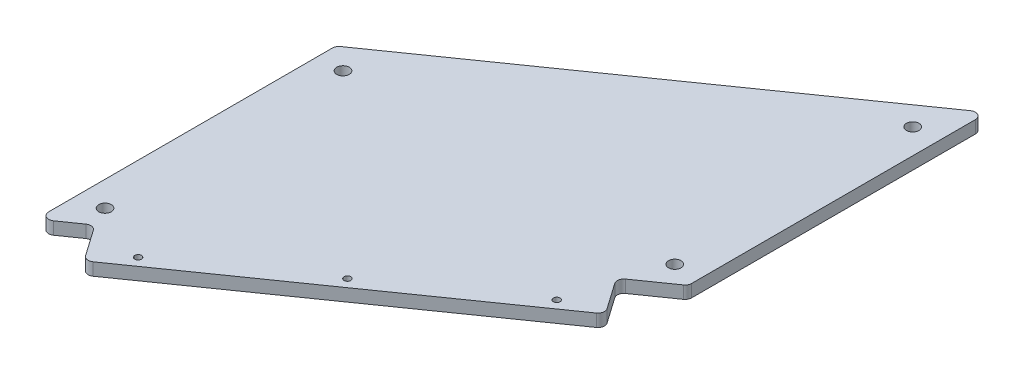
ISO-10303-21;
HEADER;
FILE_DESCRIPTION(('STEP AP214'),'2;1');
FILE_NAME('part.step','',(''),(''),'','','');
FILE_SCHEMA(('AUTOMOTIVE_DESIGN { 1 0 10303 214 1 1 1 1 }'));
ENDSEC;
DATA;
#1=APPLICATION_CONTEXT('core data for automotive mechanical design processes');
#2=APPLICATION_PROTOCOL_DEFINITION('international standard','automotive_design',2000,#1);
#3=PRODUCT_CONTEXT('',#1,'mechanical');
#4=PRODUCT('Part','Part','',(#3));
#5=PRODUCT_RELATED_PRODUCT_CATEGORY('part','',(#4));
#6=PRODUCT_DEFINITION_FORMATION('','',#4);
#7=PRODUCT_DEFINITION_CONTEXT('part definition',#1,'design');
#8=PRODUCT_DEFINITION('design','',#6,#7);
#9=PRODUCT_DEFINITION_SHAPE('','',#8);
#10=(LENGTH_UNIT() NAMED_UNIT(*) SI_UNIT(.MILLI.,.METRE.));
#11=(NAMED_UNIT(*) PLANE_ANGLE_UNIT() SI_UNIT($,.RADIAN.));
#12=(NAMED_UNIT(*) SI_UNIT($,.STERADIAN.) SOLID_ANGLE_UNIT());
#13=UNCERTAINTY_MEASURE_WITH_UNIT(LENGTH_MEASURE(1.E-05),#10,'distance_accuracy_value','');
#14=(GEOMETRIC_REPRESENTATION_CONTEXT(3) GLOBAL_UNCERTAINTY_ASSIGNED_CONTEXT((#13)) GLOBAL_UNIT_ASSIGNED_CONTEXT((#10,
#11,#12)) REPRESENTATION_CONTEXT('',''));
#15=CARTESIAN_POINT('',(0.,0.,0.));
#16=DIRECTION('',(0.,0.,1.));
#17=DIRECTION('',(1.,0.,0.));
#18=AXIS2_PLACEMENT_3D('',#15,#16,#17);
#19=CARTESIAN_POINT('',(0.,12.7,0.));
#20=DIRECTION('',(-0.573576436351042,0.,-0.819152044288995));
#21=DIRECTION('',(-0.819152044288995,0.,0.573576436351042));
#22=AXIS2_PLACEMENT_3D('',#19,#20,#21);
#23=PLANE('',#22);
#24=DIRECTION('',(0.819152044288995,0.,-0.573576436351042));
#25=VECTOR('',#24,1.);
#26=CARTESIAN_POINT('',(0.,12.7,0.));
#27=LINE('',#26,#25);
#28=CARTESIAN_POINT('',(66.3983496775089,12.7,-46.4926249688755));
#29=VERTEX_POINT('',#28);
#30=CARTESIAN_POINT('',(366.622569585501,12.7,-256.711886901579));
#31=VERTEX_POINT('',#30);
#32=EDGE_CURVE('E204',#29,#31,#27,.T.);
#33=ORIENTED_EDGE('',*,*,#32,.F.);
#34=DIRECTION('',(0.,1.,0.));
#35=VECTOR('',#34,1.);
#36=CARTESIAN_POINT('',(66.3983496775089,12.7,-46.4926249688755));
#37=LINE('',#36,#35);
#38=CARTESIAN_POINT('',(66.3983496775089,0.,-46.4926249688755));
#39=VERTEX_POINT('',#38);
#40=EDGE_CURVE('E156',#29,#39,#37,.F.);
#41=ORIENTED_EDGE('',*,*,#40,.T.);
#42=DIRECTION('',(0.819152044288995,0.,-0.573576436351042));
#43=VECTOR('',#42,1.);
#44=CARTESIAN_POINT('',(0.,0.,0.));
#45=LINE('',#44,#43);
#46=CARTESIAN_POINT('',(366.622569585501,0.,-256.711886901579));
#47=VERTEX_POINT('',#46);
#48=EDGE_CURVE('E220',#39,#47,#45,.T.);
#49=ORIENTED_EDGE('',*,*,#48,.T.);
#50=DIRECTION('',(0.,1.,0.));
#51=VECTOR('',#50,1.);
#52=CARTESIAN_POINT('',(366.622569585501,12.7,-256.711886901579));
#53=LINE('',#52,#51);
#54=EDGE_CURVE('E162',#47,#31,#53,.T.);
#55=ORIENTED_EDGE('',*,*,#54,.T.);
#56=EDGE_LOOP('',(#33,#41,#49,#55));
#57=FACE_BOUND('',#56,.T.);
#58=ADVANCED_FACE('F36',(#57),#23,.F.);
#59=CARTESIAN_POINT('',(388.9375,12.7,-272.336969392436));
#60=DIRECTION('',(-1.,0.,0.));
#61=DIRECTION('',(0.,0.,1.));
#62=AXIS2_PLACEMENT_3D('',#59,#60,#61);
#63=PLANE('',#62);
#64=DIRECTION('',(0.,0.,-1.));
#65=VECTOR('',#64,1.);
#66=CARTESIAN_POINT('',(388.9375,12.7,-272.336969392436));
#67=LINE('',#66,#65);
#68=CARTESIAN_POINT('',(388.9375,12.7,-330.968454901363));
#69=VERTEX_POINT('',#68);
#70=CARTESIAN_POINT('',(388.9375,12.7,-618.714233896365));
#71=VERTEX_POINT('',#70);
#72=EDGE_CURVE('E207',#69,#71,#67,.T.);
#73=ORIENTED_EDGE('',*,*,#72,.F.);
#74=DIRECTION('',(0.,1.,0.));
#75=VECTOR('',#74,1.);
#76=CARTESIAN_POINT('',(388.9375,12.7,-330.968454901363));
#77=LINE('',#76,#75);
#78=CARTESIAN_POINT('',(388.9375,0.,-330.968454901363));
#79=VERTEX_POINT('',#78);
#80=EDGE_CURVE('E289',#69,#79,#77,.F.);
#81=ORIENTED_EDGE('',*,*,#80,.T.);
#82=DIRECTION('',(0.,0.,-1.));
#83=VECTOR('',#82,1.);
#84=CARTESIAN_POINT('',(388.9375,0.,-272.336969392436));
#85=LINE('',#84,#83);
#86=CARTESIAN_POINT('',(388.9375,0.,-618.714233896365));
#87=VERTEX_POINT('',#86);
#88=EDGE_CURVE('E224',#79,#87,#85,.T.);
#89=ORIENTED_EDGE('',*,*,#88,.T.);
#90=DIRECTION('',(0.,-1.,0.));
#91=VECTOR('',#90,1.);
#92=CARTESIAN_POINT('',(388.9375,12.7,-618.714233896365));
#93=LINE('',#92,#91);
#94=EDGE_CURVE('E286',#87,#71,#93,.F.);
#95=ORIENTED_EDGE('',*,*,#94,.T.);
#96=EDGE_LOOP('',(#73,#81,#89,#95));
#97=FACE_BOUND('',#96,.T.);
#98=ADVANCED_FACE('F454',(#97),#63,.F.);
#99=CARTESIAN_POINT('',(0.,12.7,-359.063430470447));
#100=DIRECTION('',(0.573576436351042,0.,0.819152044288995));
#101=DIRECTION('',(0.819152044288995,0.,-0.573576436351042));
#102=AXIS2_PLACEMENT_3D('',#99,#100,#101);
#103=PLANE('',#102);
#104=DIRECTION('',(-0.819152044288995,0.,0.573576436351042));
#105=VECTOR('',#104,1.);
#106=CARTESIAN_POINT('',(0.,12.7,-359.063430470447));
#107=LINE('',#106,#105);
#108=CARTESIAN_POINT('',(378.545601214338,12.7,-624.12391399685));
#109=VERTEX_POINT('',#108);
#110=CARTESIAN_POINT('',(2.81610121433768,12.7,-361.035285769087));
#111=VERTEX_POINT('',#110);
#112=EDGE_CURVE('E212',#109,#111,#107,.T.);
#113=ORIENTED_EDGE('',*,*,#112,.F.);
#114=DIRECTION('',(0.,-1.,0.));
#115=VECTOR('',#114,1.);
#116=CARTESIAN_POINT('',(378.545601214338,12.7,-624.12391399685));
#117=LINE('',#116,#115);
#118=CARTESIAN_POINT('',(378.545601214338,0.,-624.12391399685));
#119=VERTEX_POINT('',#118);
#120=EDGE_CURVE('E295',#109,#119,#117,.T.);
#121=ORIENTED_EDGE('',*,*,#120,.T.);
#122=DIRECTION('',(-0.819152044288995,0.,0.573576436351042));
#123=VECTOR('',#122,1.);
#124=CARTESIAN_POINT('',(0.,0.,-359.063430470447));
#125=LINE('',#124,#123);
#126=CARTESIAN_POINT('',(2.81610121433768,0.,-361.035285769087));
#127=VERTEX_POINT('',#126);
#128=EDGE_CURVE('E228',#119,#127,#125,.T.);
#129=ORIENTED_EDGE('',*,*,#128,.T.);
#130=DIRECTION('',(0.,-1.,0.));
#131=VECTOR('',#130,1.);
#132=CARTESIAN_POINT('',(2.81610121433768,12.7,-361.035285769087));
#133=LINE('',#132,#131);
#134=EDGE_CURVE('E292',#127,#111,#133,.F.);
#135=ORIENTED_EDGE('',*,*,#134,.T.);
#136=EDGE_LOOP('',(#113,#121,#129,#135));
#137=FACE_BOUND('',#136,.T.);
#138=ADVANCED_FACE('F460',(#137),#103,.F.);
#139=CARTESIAN_POINT('',(0.,12.7,0.));
#140=DIRECTION('',(1.,0.,0.));
#141=DIRECTION('',(0.,0.,-1.));
#142=AXIS2_PLACEMENT_3D('',#139,#140,#141);
#143=PLANE('',#142);
#144=DIRECTION('',(0.,0.,1.));
#145=VECTOR('',#144,1.);
#146=CARTESIAN_POINT('',(0.,12.7,0.));
#147=LINE('',#146,#145);
#148=CARTESIAN_POINT('',(0.,12.7,-355.625605668603));
#149=VERTEX_POINT('',#148);
#150=CARTESIAN_POINT('',(0.,12.7,-67.8798266736002));
#151=VERTEX_POINT('',#150);
#152=EDGE_CURVE('E216',#149,#151,#147,.T.);
#153=ORIENTED_EDGE('',*,*,#152,.F.);
#154=DIRECTION('',(0.,-1.,0.));
#155=VECTOR('',#154,1.);
#156=CARTESIAN_POINT('',(0.,12.7,-355.625605668603));
#157=LINE('',#156,#155);
#158=CARTESIAN_POINT('',(0.,0.,-355.625605668603));
#159=VERTEX_POINT('',#158);
#160=EDGE_CURVE('E303',#149,#159,#157,.T.);
#161=ORIENTED_EDGE('',*,*,#160,.T.);
#162=DIRECTION('',(0.,0.,1.));
#163=VECTOR('',#162,1.);
#164=CARTESIAN_POINT('',(0.,0.,0.));
#165=LINE('',#164,#163);
#166=CARTESIAN_POINT('',(0.,0.,-67.8798266736002));
#167=VERTEX_POINT('',#166);
#168=EDGE_CURVE('E208',#159,#167,#165,.T.);
#169=ORIENTED_EDGE('',*,*,#168,.T.);
#170=DIRECTION('',(0.,1.,0.));
#171=VECTOR('',#170,1.);
#172=CARTESIAN_POINT('',(0.,12.7,-67.8798266736002));
#173=LINE('',#172,#171);
#174=EDGE_CURVE('E299',#167,#151,#173,.T.);
#175=ORIENTED_EDGE('',*,*,#174,.T.);
#176=EDGE_LOOP('',(#153,#161,#169,#175));
#177=FACE_BOUND('',#176,.T.);
#178=ADVANCED_FACE('F437',(#177),#143,.F.);
#179=CARTESIAN_POINT('',(0.,12.7,0.));
#180=DIRECTION('',(0.,1.,0.));
#181=DIRECTION('',(0.,0.,1.));
#182=AXIS2_PLACEMENT_3D('',#179,#180,#181);
#183=PLANE('',#182);
#184=CARTESIAN_POINT('',(363.5375,12.7,-580.600399862883));
#185=DIRECTION('',(0.,1.,0.));
#186=DIRECTION('',(0.,0.,1.));
#187=AXIS2_PLACEMENT_3D('',#184,#185,#186);
#188=CIRCLE('',#187,6.34999999999999);
#189=CARTESIAN_POINT('',(363.5375,12.7,-574.250399862883));
#190=VERTEX_POINT('',#189);
#191=EDGE_CURVE('E375',#190,#190,#188,.T.);
#192=ORIENTED_EDGE('',*,*,#191,.F.);
#193=EDGE_LOOP('',(#192));
#194=FACE_BOUND('',#193,.T.);
#195=CARTESIAN_POINT('',(363.5375,12.7,-339.300399862883));
#196=DIRECTION('',(0.,1.,0.));
#197=DIRECTION('',(0.,0.,1.));
#198=AXIS2_PLACEMENT_3D('',#195,#196,#197);
#199=CIRCLE('',#198,6.34999999999994);
#200=CARTESIAN_POINT('',(363.5375,12.7,-332.950399862883));
#201=VERTEX_POINT('',#200);
#202=EDGE_CURVE('E383',#201,#201,#199,.T.);
#203=ORIENTED_EDGE('',*,*,#202,.F.);
#204=EDGE_LOOP('',(#203));
#205=FACE_BOUND('',#204,.T.);
#206=CARTESIAN_POINT('',(25.4,12.7,-340.943660707083));
#207=DIRECTION('',(0.,1.,0.));
#208=DIRECTION('',(0.,0.,1.));
#209=AXIS2_PLACEMENT_3D('',#206,#207,#208);
#210=CIRCLE('',#209,6.35);
#211=CARTESIAN_POINT('',(25.4,12.7,-334.593660707083));
#212=VERTEX_POINT('',#211);
#213=EDGE_CURVE('E391',#212,#212,#210,.T.);
#214=ORIENTED_EDGE('',*,*,#213,.F.);
#215=EDGE_LOOP('',(#214));
#216=FACE_BOUND('',#215,.T.);
#217=CARTESIAN_POINT('',(25.4,12.7,-99.6436607070827));
#218=DIRECTION('',(0.,1.,0.));
#219=DIRECTION('',(0.,0.,1.));
#220=AXIS2_PLACEMENT_3D('',#217,#218,#219);
#221=CIRCLE('',#220,6.35);
#222=CARTESIAN_POINT('',(25.4,12.7,-93.2936607070828));
#223=VERTEX_POINT('',#222);
#224=EDGE_CURVE('E399',#223,#223,#221,.T.);
#225=ORIENTED_EDGE('',*,*,#224,.F.);
#226=EDGE_LOOP('',(#225));
#227=FACE_BOUND('',#226,.T.);
#228=CARTESIAN_POINT('',(85.2978199329113,12.7,-73.2920341274899));
#229=DIRECTION('',(0.,1.,0.));
#230=DIRECTION('',(0.,0.,1.));
#231=AXIS2_PLACEMENT_3D('',#228,#229,#230);
#232=CIRCLE('',#231,3.37819999999999);
#233=CARTESIAN_POINT('',(85.2978199329113,12.7,-69.9138341274899));
#234=VERTEX_POINT('',#233);
#235=EDGE_CURVE('E407',#234,#234,#232,.T.);
#236=ORIENTED_EDGE('',*,*,#235,.F.);
#237=EDGE_LOOP('',(#236));
#238=FACE_BOUND('',#237,.T.);
#239=CARTESIAN_POINT('',(334.975363032197,12.7,-248.118131927288));
#240=DIRECTION('',(0.,1.,0.));
#241=DIRECTION('',(0.,0.,1.));
#242=AXIS2_PLACEMENT_3D('',#239,#240,#241);
#243=CIRCLE('',#242,3.37819999999999);
#244=CARTESIAN_POINT('',(334.975363032197,12.7,-244.739931927288));
#245=VERTEX_POINT('',#244);
#246=EDGE_CURVE('E415',#245,#245,#243,.T.);
#247=ORIENTED_EDGE('',*,*,#246,.F.);
#248=EDGE_LOOP('',(#247));
#249=FACE_BOUND('',#248,.T.);
#250=CARTESIAN_POINT('',(210.136591482554,12.7,-160.705083027389));
#251=DIRECTION('',(0.,1.,0.));
#252=DIRECTION('',(0.,0.,1.));
#253=AXIS2_PLACEMENT_3D('',#250,#251,#252);
#254=CIRCLE('',#253,3.37819999999999);
#255=CARTESIAN_POINT('',(210.136591482554,12.7,-157.326883027389));
#256=VERTEX_POINT('',#255);
#257=EDGE_CURVE('E367',#256,#256,#254,.T.);
#258=ORIENTED_EDGE('',*,*,#257,.F.);
#259=EDGE_LOOP('',(#258));
#260=FACE_BOUND('',#259,.T.);
#261=DIRECTION('',(-0.573576436351042,0.,-0.819152044288995));
#262=VECTOR('',#261,1.);
#263=CARTESIAN_POINT('',(35.0561317367211,12.7,-79.7402284096072));
#264=LINE('',#263,#262);
#265=CARTESIAN_POINT('',(57.2007707913621,12.7,-48.1144062836977));
#266=VERTEX_POINT('',#265);
#267=CARTESIAN_POINT('',(38.8440305223833,12.7,-74.3305483091227));
#268=VERTEX_POINT('',#267);
#269=EDGE_CURVE('E169',#266,#268,#264,.T.);
#270=ORIENTED_EDGE('',*,*,#269,.F.);
#271=CARTESIAN_POINT('',(62.6104508918466,12.7,-51.90230506936));
#272=DIRECTION('',(0.,1.,0.));
#273=DIRECTION('',(0.,0.,1.));
#274=AXIS2_PLACEMENT_3D('',#271,#272,#273);
#275=CIRCLE('',#274,6.604);
#276=EDGE_CURVE('E151',#266,#29,#275,.T.);
#277=ORIENTED_EDGE('',*,*,#276,.T.);
#278=ORIENTED_EDGE('',*,*,#32,.T.);
#279=CARTESIAN_POINT('',(362.834670799839,12.7,-262.121567002064));
#280=DIRECTION('',(0.,1.,0.));
#281=DIRECTION('',(0.,0.,1.));
#282=AXIS2_PLACEMENT_3D('',#279,#280,#281);
#283=CIRCLE('',#282,6.604);
#284=CARTESIAN_POINT('',(368.244350900324,12.7,-265.909465787726));
#285=VERTEX_POINT('',#284);
#286=EDGE_CURVE('E163',#31,#285,#283,.T.);
#287=ORIENTED_EDGE('',*,*,#286,.T.);
#288=DIRECTION('',(0.573576436351042,0.,0.819152044288995));
#289=VECTOR('',#288,1.);
#290=CARTESIAN_POINT('',(346.099711845682,12.7,-297.535287913635));
#291=LINE('',#290,#289);
#292=CARTESIAN_POINT('',(349.887610631345,12.7,-292.125607813151));
#293=VERTEX_POINT('',#292);
#294=EDGE_CURVE('E195',#293,#285,#291,.T.);
#295=ORIENTED_EDGE('',*,*,#294,.F.);
#296=CARTESIAN_POINT('',(355.297290731829,12.7,-295.913506598813));
#297=DIRECTION('',(0.,1.,0.));
#298=DIRECTION('',(0.,0.,1.));
#299=AXIS2_PLACEMENT_3D('',#296,#297,#298);
#300=CIRCLE('',#299,6.604);
#301=CARTESIAN_POINT('',(351.509391946167,12.7,-301.323186699298));
#302=VERTEX_POINT('',#301);
#303=EDGE_CURVE('E314',#293,#302,#300,.F.);
#304=ORIENTED_EDGE('',*,*,#303,.T.);
#305=DIRECTION('',(-0.819152044288995,0.,0.573576436351041));
#306=VECTOR('',#305,1.);
#307=CARTESIAN_POINT('',(388.9375,12.7,-327.530630099519));
#308=LINE('',#307,#306);
#309=CARTESIAN_POINT('',(386.121398785662,12.7,-325.558774800878));
#310=VERTEX_POINT('',#309);
#311=EDGE_CURVE('E197',#310,#302,#308,.T.);
#312=ORIENTED_EDGE('',*,*,#311,.F.);
#313=CARTESIAN_POINT('',(382.3335,12.7,-330.968454901363));
#314=DIRECTION('',(0.,1.,0.));
#315=DIRECTION('',(0.,0.,1.));
#316=AXIS2_PLACEMENT_3D('',#313,#314,#315);
#317=CIRCLE('',#316,6.604);
#318=EDGE_CURVE('E245',#310,#69,#317,.T.);
#319=ORIENTED_EDGE('',*,*,#318,.T.);
#320=ORIENTED_EDGE('',*,*,#72,.T.);
#321=CARTESIAN_POINT('',(382.3335,12.7,-618.714233896365));
#322=DIRECTION('',(0.,1.,0.));
#323=DIRECTION('',(0.,0.,1.));
#324=AXIS2_PLACEMENT_3D('',#321,#322,#323);
#325=CIRCLE('',#324,6.604);
#326=EDGE_CURVE('E242',#71,#109,#325,.T.);
#327=ORIENTED_EDGE('',*,*,#326,.T.);
#328=ORIENTED_EDGE('',*,*,#112,.T.);
#329=CARTESIAN_POINT('',(6.604,12.7,-355.625605668603));
#330=DIRECTION('',(0.,1.,0.));
#331=DIRECTION('',(0.,0.,1.));
#332=AXIS2_PLACEMENT_3D('',#329,#330,#331);
#333=CIRCLE('',#332,6.604);
#334=EDGE_CURVE('E239',#111,#149,#333,.T.);
#335=ORIENTED_EDGE('',*,*,#334,.T.);
#336=ORIENTED_EDGE('',*,*,#152,.T.);
#337=CARTESIAN_POINT('',(6.604,12.7,-67.8798266736002));
#338=DIRECTION('',(0.,1.,0.));
#339=DIRECTION('',(0.,0.,1.));
#340=AXIS2_PLACEMENT_3D('',#337,#338,#339);
#341=CIRCLE('',#340,6.604);
#342=CARTESIAN_POINT('',(10.3918987856623,12.7,-62.4701465731157));
#343=VERTEX_POINT('',#342);
#344=EDGE_CURVE('E174',#151,#343,#341,.T.);
#345=ORIENTED_EDGE('',*,*,#344,.T.);
#346=DIRECTION('',(-0.819152044288995,0.,0.573576436351042));
#347=VECTOR('',#346,1.);
#348=CARTESIAN_POINT('',(0.,12.7,-55.1936607070827));
#349=LINE('',#348,#347);
#350=CARTESIAN_POINT('',(29.6464516362365,12.7,-75.9523296239449));
#351=VERTEX_POINT('',#350);
#352=EDGE_CURVE('E180',#351,#343,#349,.T.);
#353=ORIENTED_EDGE('',*,*,#352,.F.);
#354=CARTESIAN_POINT('',(33.4343504218988,12.7,-70.5426495234604));
#355=DIRECTION('',(0.,1.,0.));
#356=DIRECTION('',(0.,0.,1.));
#357=AXIS2_PLACEMENT_3D('',#354,#355,#356);
#358=CIRCLE('',#357,6.604);
#359=EDGE_CURVE('E45',#351,#268,#358,.F.);
#360=ORIENTED_EDGE('',*,*,#359,.T.);
#361=EDGE_LOOP('',(#270,#277,#278,#287,#295,#304,#312,#319,#320,#327,#328,#335,#336,#345,#353,#360));
#362=FACE_BOUND('',#361,.T.);
#363=ADVANCED_FACE('F177',(#194,#205,#216,#227,#238,#249,#260,#362),#183,.T.);
#364=CARTESIAN_POINT('',(0.,0.,0.));
#365=DIRECTION('',(0.,1.,0.));
#366=DIRECTION('',(0.,0.,1.));
#367=AXIS2_PLACEMENT_3D('',#364,#365,#366);
#368=PLANE('',#367);
#369=CARTESIAN_POINT('',(363.5375,0.,-580.600399862883));
#370=DIRECTION('',(0.,1.,0.));
#371=DIRECTION('',(0.,0.,1.));
#372=AXIS2_PLACEMENT_3D('',#369,#370,#371);
#373=CIRCLE('',#372,6.34999999999999);
#374=CARTESIAN_POINT('',(363.5375,0.,-574.250399862883));
#375=VERTEX_POINT('',#374);
#376=EDGE_CURVE('E379',#375,#375,#373,.T.);
#377=ORIENTED_EDGE('',*,*,#376,.T.);
#378=EDGE_LOOP('',(#377));
#379=FACE_BOUND('',#378,.T.);
#380=CARTESIAN_POINT('',(363.5375,0.,-339.300399862883));
#381=DIRECTION('',(0.,1.,0.));
#382=DIRECTION('',(0.,0.,1.));
#383=AXIS2_PLACEMENT_3D('',#380,#381,#382);
#384=CIRCLE('',#383,6.34999999999994);
#385=CARTESIAN_POINT('',(363.5375,0.,-332.950399862883));
#386=VERTEX_POINT('',#385);
#387=EDGE_CURVE('E387',#386,#386,#384,.T.);
#388=ORIENTED_EDGE('',*,*,#387,.T.);
#389=EDGE_LOOP('',(#388));
#390=FACE_BOUND('',#389,.T.);
#391=CARTESIAN_POINT('',(25.4,0.,-340.943660707083));
#392=DIRECTION('',(0.,1.,0.));
#393=DIRECTION('',(0.,0.,1.));
#394=AXIS2_PLACEMENT_3D('',#391,#392,#393);
#395=CIRCLE('',#394,6.35);
#396=CARTESIAN_POINT('',(25.4,0.,-334.593660707083));
#397=VERTEX_POINT('',#396);
#398=EDGE_CURVE('E395',#397,#397,#395,.T.);
#399=ORIENTED_EDGE('',*,*,#398,.T.);
#400=EDGE_LOOP('',(#399));
#401=FACE_BOUND('',#400,.T.);
#402=CARTESIAN_POINT('',(25.4,0.,-99.6436607070827));
#403=DIRECTION('',(0.,1.,0.));
#404=DIRECTION('',(0.,0.,1.));
#405=AXIS2_PLACEMENT_3D('',#402,#403,#404);
#406=CIRCLE('',#405,6.35);
#407=CARTESIAN_POINT('',(25.4,0.,-93.2936607070828));
#408=VERTEX_POINT('',#407);
#409=EDGE_CURVE('E403',#408,#408,#406,.T.);
#410=ORIENTED_EDGE('',*,*,#409,.T.);
#411=EDGE_LOOP('',(#410));
#412=FACE_BOUND('',#411,.T.);
#413=CARTESIAN_POINT('',(85.2978199329113,0.,-73.2920341274899));
#414=DIRECTION('',(0.,1.,0.));
#415=DIRECTION('',(0.,0.,1.));
#416=AXIS2_PLACEMENT_3D('',#413,#414,#415);
#417=CIRCLE('',#416,3.37819999999999);
#418=CARTESIAN_POINT('',(85.2978199329113,0.,-69.9138341274899));
#419=VERTEX_POINT('',#418);
#420=EDGE_CURVE('E411',#419,#419,#417,.T.);
#421=ORIENTED_EDGE('',*,*,#420,.T.);
#422=EDGE_LOOP('',(#421));
#423=FACE_BOUND('',#422,.T.);
#424=CARTESIAN_POINT('',(334.975363032197,0.,-248.118131927288));
#425=DIRECTION('',(0.,1.,0.));
#426=DIRECTION('',(0.,0.,1.));
#427=AXIS2_PLACEMENT_3D('',#424,#425,#426);
#428=CIRCLE('',#427,3.37819999999999);
#429=CARTESIAN_POINT('',(334.975363032197,0.,-244.739931927288));
#430=VERTEX_POINT('',#429);
#431=EDGE_CURVE('E371',#430,#430,#428,.T.);
#432=ORIENTED_EDGE('',*,*,#431,.T.);
#433=EDGE_LOOP('',(#432));
#434=FACE_BOUND('',#433,.T.);
#435=CARTESIAN_POINT('',(210.136591482554,0.,-160.705083027389));
#436=DIRECTION('',(0.,1.,0.));
#437=DIRECTION('',(0.,0.,1.));
#438=AXIS2_PLACEMENT_3D('',#435,#436,#437);
#439=CIRCLE('',#438,3.37819999999999);
#440=CARTESIAN_POINT('',(210.136591482554,0.,-157.326883027389));
#441=VERTEX_POINT('',#440);
#442=EDGE_CURVE('E201',#441,#441,#439,.T.);
#443=ORIENTED_EDGE('',*,*,#442,.T.);
#444=EDGE_LOOP('',(#443));
#445=FACE_BOUND('',#444,.T.);
#446=ORIENTED_EDGE('',*,*,#48,.F.);
#447=CARTESIAN_POINT('',(62.6104508918466,0.,-51.90230506936));
#448=DIRECTION('',(0.,1.,0.));
#449=DIRECTION('',(0.,0.,1.));
#450=AXIS2_PLACEMENT_3D('',#447,#448,#449);
#451=CIRCLE('',#450,6.604);
#452=CARTESIAN_POINT('',(57.2007707913621,0.,-48.1144062836977));
#453=VERTEX_POINT('',#452);
#454=EDGE_CURVE('E270',#39,#453,#451,.F.);
#455=ORIENTED_EDGE('',*,*,#454,.T.);
#456=DIRECTION('',(-0.573576436351042,0.,-0.819152044288995));
#457=VECTOR('',#456,1.);
#458=CARTESIAN_POINT('',(35.0561317367211,0.,-79.7402284096072));
#459=LINE('',#458,#457);
#460=CARTESIAN_POINT('',(38.8440305223833,0.,-74.3305483091227));
#461=VERTEX_POINT('',#460);
#462=EDGE_CURVE('E172',#453,#461,#459,.T.);
#463=ORIENTED_EDGE('',*,*,#462,.T.);
#464=CARTESIAN_POINT('',(33.4343504218988,0.,-70.5426495234604));
#465=DIRECTION('',(0.,1.,0.));
#466=DIRECTION('',(0.,0.,1.));
#467=AXIS2_PLACEMENT_3D('',#464,#465,#466);
#468=CIRCLE('',#467,6.604);
#469=CARTESIAN_POINT('',(29.6464516362365,0.,-75.9523296239449));
#470=VERTEX_POINT('',#469);
#471=EDGE_CURVE('E11',#461,#470,#468,.T.);
#472=ORIENTED_EDGE('',*,*,#471,.T.);
#473=DIRECTION('',(-0.819152044288995,0.,0.573576436351042));
#474=VECTOR('',#473,1.);
#475=CARTESIAN_POINT('',(0.,0.,-55.1936607070827));
#476=LINE('',#475,#474);
#477=CARTESIAN_POINT('',(10.3918987856623,0.,-62.4701465731157));
#478=VERTEX_POINT('',#477);
#479=EDGE_CURVE('E191',#470,#478,#476,.T.);
#480=ORIENTED_EDGE('',*,*,#479,.T.);
#481=CARTESIAN_POINT('',(6.604,0.,-67.8798266736002));
#482=DIRECTION('',(0.,1.,0.));
#483=DIRECTION('',(0.,0.,1.));
#484=AXIS2_PLACEMENT_3D('',#481,#482,#483);
#485=CIRCLE('',#484,6.604);
#486=EDGE_CURVE('E255',#478,#167,#485,.F.);
#487=ORIENTED_EDGE('',*,*,#486,.T.);
#488=ORIENTED_EDGE('',*,*,#168,.F.);
#489=CARTESIAN_POINT('',(6.604,0.,-355.625605668603));
#490=DIRECTION('',(0.,1.,0.));
#491=DIRECTION('',(0.,0.,1.));
#492=AXIS2_PLACEMENT_3D('',#489,#490,#491);
#493=CIRCLE('',#492,6.604);
#494=EDGE_CURVE('E258',#159,#127,#493,.F.);
#495=ORIENTED_EDGE('',*,*,#494,.T.);
#496=ORIENTED_EDGE('',*,*,#128,.F.);
#497=CARTESIAN_POINT('',(382.3335,0.,-618.714233896365));
#498=DIRECTION('',(0.,1.,0.));
#499=DIRECTION('',(0.,0.,1.));
#500=AXIS2_PLACEMENT_3D('',#497,#498,#499);
#501=CIRCLE('',#500,6.604);
#502=EDGE_CURVE('E261',#119,#87,#501,.F.);
#503=ORIENTED_EDGE('',*,*,#502,.T.);
#504=ORIENTED_EDGE('',*,*,#88,.F.);
#505=CARTESIAN_POINT('',(382.3335,0.,-330.968454901363));
#506=DIRECTION('',(0.,1.,0.));
#507=DIRECTION('',(0.,0.,1.));
#508=AXIS2_PLACEMENT_3D('',#505,#506,#507);
#509=CIRCLE('',#508,6.604);
#510=CARTESIAN_POINT('',(386.121398785662,0.,-325.558774800878));
#511=VERTEX_POINT('',#510);
#512=EDGE_CURVE('E264',#79,#511,#509,.F.);
#513=ORIENTED_EDGE('',*,*,#512,.T.);
#514=DIRECTION('',(-0.819152044288995,0.,0.573576436351041));
#515=VECTOR('',#514,1.);
#516=CARTESIAN_POINT('',(388.9375,0.,-327.530630099519));
#517=LINE('',#516,#515);
#518=CARTESIAN_POINT('',(351.509391946167,0.,-301.323186699298));
#519=VERTEX_POINT('',#518);
#520=EDGE_CURVE('E188',#511,#519,#517,.T.);
#521=ORIENTED_EDGE('',*,*,#520,.T.);
#522=CARTESIAN_POINT('',(355.297290731829,0.,-295.913506598813));
#523=DIRECTION('',(0.,1.,0.));
#524=DIRECTION('',(0.,0.,1.));
#525=AXIS2_PLACEMENT_3D('',#522,#523,#524);
#526=CIRCLE('',#525,6.604);
#527=CARTESIAN_POINT('',(349.887610631345,0.,-292.125607813151));
#528=VERTEX_POINT('',#527);
#529=EDGE_CURVE('E59',#519,#528,#526,.T.);
#530=ORIENTED_EDGE('',*,*,#529,.T.);
#531=DIRECTION('',(0.573576436351042,0.,0.819152044288995));
#532=VECTOR('',#531,1.);
#533=CARTESIAN_POINT('',(346.099711845682,0.,-297.535287913635));
#534=LINE('',#533,#532);
#535=CARTESIAN_POINT('',(368.244350900324,0.,-265.909465787726));
#536=VERTEX_POINT('',#535);
#537=EDGE_CURVE('E181',#528,#536,#534,.T.);
#538=ORIENTED_EDGE('',*,*,#537,.T.);
#539=CARTESIAN_POINT('',(362.834670799839,0.,-262.121567002064));
#540=DIRECTION('',(0.,1.,0.));
#541=DIRECTION('',(0.,0.,1.));
#542=AXIS2_PLACEMENT_3D('',#539,#540,#541);
#543=CIRCLE('',#542,6.604);
#544=EDGE_CURVE('E267',#536,#47,#543,.F.);
#545=ORIENTED_EDGE('',*,*,#544,.T.);
#546=EDGE_LOOP('',(#446,#455,#463,#472,#480,#487,#488,#495,#496,#503,#504,#513,#521,#530,#538,#545));
#547=FACE_BOUND('',#546,.T.);
#548=ADVANCED_FACE('F424',(#379,#390,#401,#412,#423,#434,#445,#547),#368,.F.);
#549=CARTESIAN_POINT('',(346.099711845682,0.,-297.535287913635));
#550=DIRECTION('',(-0.819152044288995,0.,0.573576436351042));
#551=DIRECTION('',(0.573576436351042,0.,0.819152044288995));
#552=AXIS2_PLACEMENT_3D('',#549,#550,#551);
#553=PLANE('',#552);
#554=ORIENTED_EDGE('',*,*,#294,.T.);
#555=DIRECTION('',(0.,1.,0.));
#556=VECTOR('',#555,1.);
#557=CARTESIAN_POINT('',(368.244350900324,0.,-265.909465787726));
#558=LINE('',#557,#556);
#559=EDGE_CURVE('E52',#285,#536,#558,.F.);
#560=ORIENTED_EDGE('',*,*,#559,.T.);
#561=ORIENTED_EDGE('',*,*,#537,.F.);
#562=DIRECTION('',(0.,1.,0.));
#563=VECTOR('',#562,1.);
#564=CARTESIAN_POINT('',(349.887610631345,12.7,-292.125607813151));
#565=LINE('',#564,#563);
#566=EDGE_CURVE('E273',#528,#293,#565,.T.);
#567=ORIENTED_EDGE('',*,*,#566,.T.);
#568=EDGE_LOOP('',(#554,#560,#561,#567));
#569=FACE_BOUND('',#568,.T.);
#570=ADVANCED_FACE('F497',(#569),#553,.F.);
#571=CARTESIAN_POINT('',(388.9375,0.,-327.530630099519));
#572=DIRECTION('',(-0.573576436351041,0.,-0.819152044288995));
#573=DIRECTION('',(-0.819152044288995,0.,0.573576436351042));
#574=AXIS2_PLACEMENT_3D('',#571,#572,#573);
#575=PLANE('',#574);
#576=ORIENTED_EDGE('',*,*,#520,.F.);
#577=DIRECTION('',(0.,1.,0.));
#578=VECTOR('',#577,1.);
#579=CARTESIAN_POINT('',(386.121398785662,0.,-325.558774800878));
#580=LINE('',#579,#578);
#581=EDGE_CURVE('E282',#511,#310,#580,.T.);
#582=ORIENTED_EDGE('',*,*,#581,.T.);
#583=ORIENTED_EDGE('',*,*,#311,.T.);
#584=DIRECTION('',(0.,1.,0.));
#585=VECTOR('',#584,1.);
#586=CARTESIAN_POINT('',(351.509391946167,0.,-301.323186699298));
#587=LINE('',#586,#585);
#588=EDGE_CURVE('E279',#302,#519,#587,.F.);
#589=ORIENTED_EDGE('',*,*,#588,.T.);
#590=EDGE_LOOP('',(#576,#582,#583,#589));
#591=FACE_BOUND('',#590,.T.);
#592=ADVANCED_FACE('F508',(#591),#575,.F.);
#593=CARTESIAN_POINT('',(0.,0.,-55.1936607070827));
#594=DIRECTION('',(-0.573576436351042,0.,-0.819152044288994));
#595=DIRECTION('',(-0.819152044288995,0.,0.573576436351042));
#596=AXIS2_PLACEMENT_3D('',#593,#594,#595);
#597=PLANE('',#596);
#598=ORIENTED_EDGE('',*,*,#352,.T.);
#599=DIRECTION('',(0.,1.,0.));
#600=VECTOR('',#599,1.);
#601=CARTESIAN_POINT('',(10.3918987856623,0.,-62.4701465731157));
#602=LINE('',#601,#600);
#603=EDGE_CURVE('E311',#343,#478,#602,.F.);
#604=ORIENTED_EDGE('',*,*,#603,.T.);
#605=ORIENTED_EDGE('',*,*,#479,.F.);
#606=DIRECTION('',(0.,1.,0.));
#607=VECTOR('',#606,1.);
#608=CARTESIAN_POINT('',(29.6464516362365,12.7,-75.9523296239449));
#609=LINE('',#608,#607);
#610=EDGE_CURVE('E307',#470,#351,#609,.T.);
#611=ORIENTED_EDGE('',*,*,#610,.T.);
#612=EDGE_LOOP('',(#598,#604,#605,#611));
#613=FACE_BOUND('',#612,.T.);
#614=ADVANCED_FACE('F448',(#613),#597,.F.);
#615=CARTESIAN_POINT('',(35.0561317367211,0.,-79.7402284096072));
#616=DIRECTION('',(0.819152044288995,0.,-0.573576436351042));
#617=DIRECTION('',(-0.573576436351042,0.,-0.819152044288995));
#618=AXIS2_PLACEMENT_3D('',#615,#616,#617);
#619=PLANE('',#618);
#620=ORIENTED_EDGE('',*,*,#462,.F.);
#621=DIRECTION('',(0.,1.,0.));
#622=VECTOR('',#621,1.);
#623=CARTESIAN_POINT('',(57.2007707913621,0.,-48.1144062836977));
#624=LINE('',#623,#622);
#625=EDGE_CURVE('E155',#453,#266,#624,.T.);
#626=ORIENTED_EDGE('',*,*,#625,.T.);
#627=ORIENTED_EDGE('',*,*,#269,.T.);
#628=DIRECTION('',(0.,1.,0.));
#629=VECTOR('',#628,1.);
#630=CARTESIAN_POINT('',(38.8440305223833,0.,-74.3305483091227));
#631=LINE('',#630,#629);
#632=EDGE_CURVE('E175',#268,#461,#631,.F.);
#633=ORIENTED_EDGE('',*,*,#632,.T.);
#634=EDGE_LOOP('',(#620,#626,#627,#633));
#635=FACE_BOUND('',#634,.T.);
#636=ADVANCED_FACE('F168',(#635),#619,.F.);
#637=CARTESIAN_POINT('',(210.136591482554,0.,-160.705083027389));
#638=DIRECTION('',(0.,1.,0.));
#639=DIRECTION('',(0.,0.,1.));
#640=AXIS2_PLACEMENT_3D('',#637,#638,#639);
#641=CYLINDRICAL_SURFACE('',#640,3.37819999999999);
#642=ORIENTED_EDGE('',*,*,#442,.F.);
#643=EDGE_LOOP('',(#642));
#644=FACE_BOUND('',#643,.T.);
#645=ORIENTED_EDGE('',*,*,#257,.T.);
#646=EDGE_LOOP('',(#645));
#647=FACE_BOUND('',#646,.T.);
#648=ADVANCED_FACE('F431',(#644,#647),#641,.F.);
#649=CARTESIAN_POINT('',(334.975363032197,0.,-248.118131927288));
#650=DIRECTION('',(0.,1.,0.));
#651=DIRECTION('',(0.,0.,1.));
#652=AXIS2_PLACEMENT_3D('',#649,#650,#651);
#653=CYLINDRICAL_SURFACE('',#652,3.37819999999999);
#654=ORIENTED_EDGE('',*,*,#431,.F.);
#655=EDGE_LOOP('',(#654));
#656=FACE_BOUND('',#655,.T.);
#657=ORIENTED_EDGE('',*,*,#246,.T.);
#658=EDGE_LOOP('',(#657));
#659=FACE_BOUND('',#658,.T.);
#660=ADVANCED_FACE('F427',(#656,#659),#653,.F.);
#661=CARTESIAN_POINT('',(85.2978199329113,0.,-73.2920341274899));
#662=DIRECTION('',(0.,1.,0.));
#663=DIRECTION('',(0.,0.,1.));
#664=AXIS2_PLACEMENT_3D('',#661,#662,#663);
#665=CYLINDRICAL_SURFACE('',#664,3.37819999999999);
#666=ORIENTED_EDGE('',*,*,#420,.F.);
#667=EDGE_LOOP('',(#666));
#668=FACE_BOUND('',#667,.T.);
#669=ORIENTED_EDGE('',*,*,#235,.T.);
#670=EDGE_LOOP('',(#669));
#671=FACE_BOUND('',#670,.T.);
#672=ADVANCED_FACE('F430',(#668,#671),#665,.F.);
#673=CARTESIAN_POINT('',(25.4,0.,-99.6436607070827));
#674=DIRECTION('',(0.,1.,0.));
#675=DIRECTION('',(0.,0.,1.));
#676=AXIS2_PLACEMENT_3D('',#673,#674,#675);
#677=CYLINDRICAL_SURFACE('',#676,6.35);
#678=ORIENTED_EDGE('',*,*,#409,.F.);
#679=EDGE_LOOP('',(#678));
#680=FACE_BOUND('',#679,.T.);
#681=ORIENTED_EDGE('',*,*,#224,.T.);
#682=EDGE_LOOP('',(#681));
#683=FACE_BOUND('',#682,.T.);
#684=ADVANCED_FACE('F572',(#680,#683),#677,.F.);
#685=CARTESIAN_POINT('',(25.4,0.,-340.943660707083));
#686=DIRECTION('',(0.,1.,0.));
#687=DIRECTION('',(0.,0.,1.));
#688=AXIS2_PLACEMENT_3D('',#685,#686,#687);
#689=CYLINDRICAL_SURFACE('',#688,6.35);
#690=ORIENTED_EDGE('',*,*,#398,.F.);
#691=EDGE_LOOP('',(#690));
#692=FACE_BOUND('',#691,.T.);
#693=ORIENTED_EDGE('',*,*,#213,.T.);
#694=EDGE_LOOP('',(#693));
#695=FACE_BOUND('',#694,.T.);
#696=ADVANCED_FACE('F582',(#692,#695),#689,.F.);
#697=CARTESIAN_POINT('',(363.5375,0.,-339.300399862883));
#698=DIRECTION('',(0.,1.,0.));
#699=DIRECTION('',(0.,0.,1.));
#700=AXIS2_PLACEMENT_3D('',#697,#698,#699);
#701=CYLINDRICAL_SURFACE('',#700,6.34999999999994);
#702=ORIENTED_EDGE('',*,*,#387,.F.);
#703=EDGE_LOOP('',(#702));
#704=FACE_BOUND('',#703,.T.);
#705=ORIENTED_EDGE('',*,*,#202,.T.);
#706=EDGE_LOOP('',(#705));
#707=FACE_BOUND('',#706,.T.);
#708=ADVANCED_FACE('F592',(#704,#707),#701,.F.);
#709=CARTESIAN_POINT('',(363.5375,0.,-580.600399862883));
#710=DIRECTION('',(0.,1.,0.));
#711=DIRECTION('',(0.,0.,1.));
#712=AXIS2_PLACEMENT_3D('',#709,#710,#711);
#713=CYLINDRICAL_SURFACE('',#712,6.34999999999999);
#714=ORIENTED_EDGE('',*,*,#376,.F.);
#715=EDGE_LOOP('',(#714));
#716=FACE_BOUND('',#715,.T.);
#717=ORIENTED_EDGE('',*,*,#191,.T.);
#718=EDGE_LOOP('',(#717));
#719=FACE_BOUND('',#718,.T.);
#720=ADVANCED_FACE('F468',(#716,#719),#713,.F.);
#721=CARTESIAN_POINT('',(62.6104508918466,0.,-51.90230506936));
#722=DIRECTION('',(0.,1.,0.));
#723=DIRECTION('',(0.,0.,1.));
#724=AXIS2_PLACEMENT_3D('',#721,#722,#723);
#725=CYLINDRICAL_SURFACE('',#724,6.604);
#726=ORIENTED_EDGE('',*,*,#454,.F.);
#727=ORIENTED_EDGE('',*,*,#40,.F.);
#728=ORIENTED_EDGE('',*,*,#276,.F.);
#729=ORIENTED_EDGE('',*,*,#625,.F.);
#730=EDGE_LOOP('',(#726,#727,#728,#729));
#731=FACE_BOUND('',#730,.T.);
#732=ADVANCED_FACE('F154',(#731),#725,.T.);
#733=CARTESIAN_POINT('',(362.834670799839,12.7,-262.121567002064));
#734=DIRECTION('',(0.,1.,0.));
#735=DIRECTION('',(0.,0.,1.));
#736=AXIS2_PLACEMENT_3D('',#733,#734,#735);
#737=CYLINDRICAL_SURFACE('',#736,6.604);
#738=ORIENTED_EDGE('',*,*,#544,.F.);
#739=ORIENTED_EDGE('',*,*,#559,.F.);
#740=ORIENTED_EDGE('',*,*,#286,.F.);
#741=ORIENTED_EDGE('',*,*,#54,.F.);
#742=EDGE_LOOP('',(#738,#739,#740,#741));
#743=FACE_BOUND('',#742,.T.);
#744=ADVANCED_FACE('F467',(#743),#737,.T.);
#745=CARTESIAN_POINT('',(382.3335,0.,-330.968454901363));
#746=DIRECTION('',(0.,1.,0.));
#747=DIRECTION('',(0.,0.,1.));
#748=AXIS2_PLACEMENT_3D('',#745,#746,#747);
#749=CYLINDRICAL_SURFACE('',#748,6.604);
#750=ORIENTED_EDGE('',*,*,#512,.F.);
#751=ORIENTED_EDGE('',*,*,#80,.F.);
#752=ORIENTED_EDGE('',*,*,#318,.F.);
#753=ORIENTED_EDGE('',*,*,#581,.F.);
#754=EDGE_LOOP('',(#750,#751,#752,#753));
#755=FACE_BOUND('',#754,.T.);
#756=ADVANCED_FACE('F471',(#755),#749,.T.);
#757=CARTESIAN_POINT('',(382.3335,12.7,-618.714233896365));
#758=DIRECTION('',(0.,-1.,0.));
#759=DIRECTION('',(0.,0.,-1.));
#760=AXIS2_PLACEMENT_3D('',#757,#758,#759);
#761=CYLINDRICAL_SURFACE('',#760,6.604);
#762=ORIENTED_EDGE('',*,*,#326,.F.);
#763=ORIENTED_EDGE('',*,*,#94,.F.);
#764=ORIENTED_EDGE('',*,*,#502,.F.);
#765=ORIENTED_EDGE('',*,*,#120,.F.);
#766=EDGE_LOOP('',(#762,#763,#764,#765));
#767=FACE_BOUND('',#766,.T.);
#768=ADVANCED_FACE('F475',(#767),#761,.T.);
#769=CARTESIAN_POINT('',(6.604,12.7,-355.625605668603));
#770=DIRECTION('',(0.,-1.,0.));
#771=DIRECTION('',(0.,0.,-1.));
#772=AXIS2_PLACEMENT_3D('',#769,#770,#771);
#773=CYLINDRICAL_SURFACE('',#772,6.604);
#774=ORIENTED_EDGE('',*,*,#334,.F.);
#775=ORIENTED_EDGE('',*,*,#134,.F.);
#776=ORIENTED_EDGE('',*,*,#494,.F.);
#777=ORIENTED_EDGE('',*,*,#160,.F.);
#778=EDGE_LOOP('',(#774,#775,#776,#777));
#779=FACE_BOUND('',#778,.T.);
#780=ADVANCED_FACE('F479',(#779),#773,.T.);
#781=CARTESIAN_POINT('',(6.604,12.7,-67.8798266736002));
#782=DIRECTION('',(0.,1.,0.));
#783=DIRECTION('',(0.,0.,1.));
#784=AXIS2_PLACEMENT_3D('',#781,#782,#783);
#785=CYLINDRICAL_SURFACE('',#784,6.604);
#786=ORIENTED_EDGE('',*,*,#486,.F.);
#787=ORIENTED_EDGE('',*,*,#603,.F.);
#788=ORIENTED_EDGE('',*,*,#344,.F.);
#789=ORIENTED_EDGE('',*,*,#174,.F.);
#790=EDGE_LOOP('',(#786,#787,#788,#789));
#791=FACE_BOUND('',#790,.T.);
#792=ADVANCED_FACE('F483',(#791),#785,.T.);
#793=CARTESIAN_POINT('',(355.297290731829,0.,-295.913506598813));
#794=DIRECTION('',(0.,-1.,0.));
#795=DIRECTION('',(0.,0.,-1.));
#796=AXIS2_PLACEMENT_3D('',#793,#794,#795);
#797=CYLINDRICAL_SURFACE('',#796,6.604);
#798=ORIENTED_EDGE('',*,*,#529,.F.);
#799=ORIENTED_EDGE('',*,*,#588,.F.);
#800=ORIENTED_EDGE('',*,*,#303,.F.);
#801=ORIENTED_EDGE('',*,*,#566,.F.);
#802=EDGE_LOOP('',(#798,#799,#800,#801));
#803=FACE_BOUND('',#802,.T.);
#804=ADVANCED_FACE('F486',(#803),#797,.F.);
#805=CARTESIAN_POINT('',(33.4343504218988,0.,-70.5426495234604));
#806=DIRECTION('',(0.,-1.,0.));
#807=DIRECTION('',(0.,0.,-1.));
#808=AXIS2_PLACEMENT_3D('',#805,#806,#807);
#809=CYLINDRICAL_SURFACE('',#808,6.604);
#810=ORIENTED_EDGE('',*,*,#471,.F.);
#811=ORIENTED_EDGE('',*,*,#632,.F.);
#812=ORIENTED_EDGE('',*,*,#359,.F.);
#813=ORIENTED_EDGE('',*,*,#610,.F.);
#814=EDGE_LOOP('',(#810,#811,#812,#813));
#815=FACE_BOUND('',#814,.T.);
#816=ADVANCED_FACE('F38',(#815),#809,.F.);
#817=CLOSED_SHELL('',(#58,#98,#138,#178,#363,#548,#570,#592,#614,#636,#648,#660,#672,#684,#696,
#708,#720,#732,#744,#756,#768,#780,#792,#804,#816));
#818=MANIFOLD_SOLID_BREP('B2',#817);
#819=ADVANCED_BREP_SHAPE_REPRESENTATION('',(#18,#818),#14);
#820=SHAPE_DEFINITION_REPRESENTATION(#9,#819);
ENDSEC;
END-ISO-10303-21;
